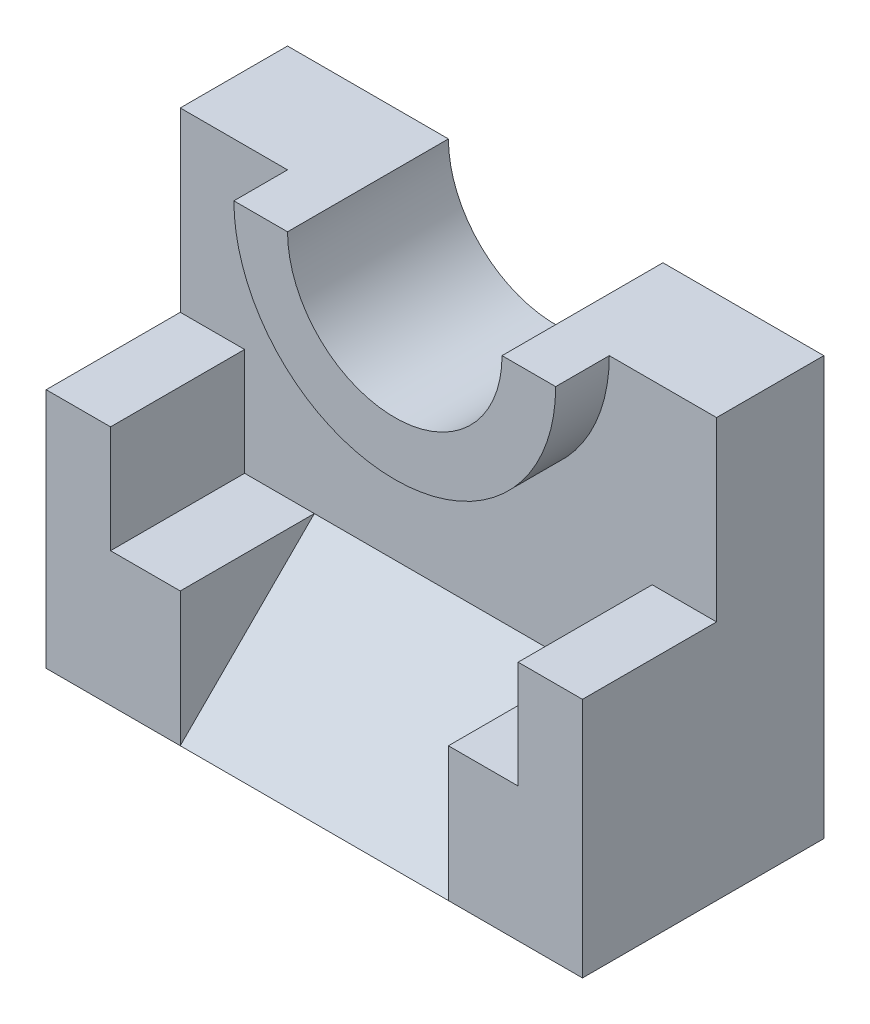
ISO-10303-21;
HEADER;
FILE_DESCRIPTION(('STEP AP214'),'2;1');
FILE_NAME('part.step','',(''),(''),'','','');
FILE_SCHEMA(('AUTOMOTIVE_DESIGN { 1 0 10303 214 1 1 1 1 }'));
ENDSEC;
DATA;
#1=APPLICATION_CONTEXT('core data for automotive mechanical design processes');
#2=APPLICATION_PROTOCOL_DEFINITION('international standard','automotive_design',2000,#1);
#3=PRODUCT_CONTEXT('',#1,'mechanical');
#4=PRODUCT('Part','Part','',(#3));
#5=PRODUCT_RELATED_PRODUCT_CATEGORY('part','',(#4));
#6=PRODUCT_DEFINITION_FORMATION('','',#4);
#7=PRODUCT_DEFINITION_CONTEXT('part definition',#1,'design');
#8=PRODUCT_DEFINITION('design','',#6,#7);
#9=PRODUCT_DEFINITION_SHAPE('','',#8);
#10=(LENGTH_UNIT() NAMED_UNIT(*) SI_UNIT(.MILLI.,.METRE.));
#11=(NAMED_UNIT(*) PLANE_ANGLE_UNIT() SI_UNIT($,.RADIAN.));
#12=(NAMED_UNIT(*) SI_UNIT($,.STERADIAN.) SOLID_ANGLE_UNIT());
#13=UNCERTAINTY_MEASURE_WITH_UNIT(LENGTH_MEASURE(1.E-05),#10,'distance_accuracy_value','');
#14=(GEOMETRIC_REPRESENTATION_CONTEXT(3) GLOBAL_UNCERTAINTY_ASSIGNED_CONTEXT((#13)) GLOBAL_UNIT_ASSIGNED_CONTEXT((#10,
#11,#12)) REPRESENTATION_CONTEXT('',''));
#15=CARTESIAN_POINT('',(0.,0.,0.));
#16=DIRECTION('',(0.,0.,1.));
#17=DIRECTION('',(1.,0.,0.));
#18=AXIS2_PLACEMENT_3D('',#15,#16,#17);
#19=CARTESIAN_POINT('',(71.6951431076401,-12.1166014811314,20.));
#20=DIRECTION('',(0.,-0.707106781186547,-0.707106781186548));
#21=DIRECTION('',(0.,0.707106781186548,-0.707106781186547));
#22=AXIS2_PLACEMENT_3D('',#19,#20,#21);
#23=PLANE('',#22);
#24=DIRECTION('',(0.,-0.707106781186548,0.707106781186547));
#25=VECTOR('',#24,1.);
#26=CARTESIAN_POINT('',(6.69514310764004,-12.1166014811314,20.));
#27=LINE('',#26,#25);
#28=CARTESIAN_POINT('',(6.69514310764004,-12.1166014811314,20.));
#29=VERTEX_POINT('',#28);
#30=CARTESIAN_POINT('',(6.69514310764004,-37.1166014811314,45.));
#31=VERTEX_POINT('',#30);
#32=EDGE_CURVE('E165',#29,#31,#27,.T.);
#33=ORIENTED_EDGE('',*,*,#32,.F.);
#34=DIRECTION('',(1.,0.,0.));
#35=VECTOR('',#34,1.);
#36=CARTESIAN_POINT('',(0.,-12.1166014811314,20.));
#37=LINE('',#36,#35);
#38=CARTESIAN_POINT('',(-43.30485689236,-12.1166014811314,20.));
#39=VERTEX_POINT('',#38);
#40=EDGE_CURVE('E62',#39,#29,#37,.T.);
#41=ORIENTED_EDGE('',*,*,#40,.F.);
#42=DIRECTION('',(0.,-0.707106781186548,0.707106781186547));
#43=VECTOR('',#42,1.);
#44=CARTESIAN_POINT('',(-43.30485689236,-12.1166014811314,20.));
#45=LINE('',#44,#43);
#46=CARTESIAN_POINT('',(-43.30485689236,-37.1166014811314,45.));
#47=VERTEX_POINT('',#46);
#48=EDGE_CURVE('E57',#39,#47,#45,.T.);
#49=ORIENTED_EDGE('',*,*,#48,.T.);
#50=DIRECTION('',(1.,0.,0.));
#51=VECTOR('',#50,1.);
#52=CARTESIAN_POINT('',(0.,-37.1166014811314,45.));
#53=LINE('',#52,#51);
#54=EDGE_CURVE('E183',#47,#31,#53,.T.);
#55=ORIENTED_EDGE('',*,*,#54,.T.);
#56=EDGE_LOOP('',(#33,#41,#49,#55));
#57=FACE_BOUND('',#56,.T.);
#58=ADVANCED_FACE('F41',(#57),#23,.F.);
#59=CARTESIAN_POINT('',(0.,0.,45.));
#60=DIRECTION('',(0.,0.,1.));
#61=DIRECTION('',(1.,0.,0.));
#62=AXIS2_PLACEMENT_3D('',#59,#60,#61);
#63=PLANE('',#62);
#64=DIRECTION('',(0.,-1.,0.));
#65=VECTOR('',#64,1.);
#66=CARTESIAN_POINT('',(19.69514310764,0.,45.));
#67=LINE('',#66,#65);
#68=CARTESIAN_POINT('',(19.69514310764,7.88339851886856,45.));
#69=VERTEX_POINT('',#68);
#70=CARTESIAN_POINT('',(19.69514310764,-12.1166014811314,45.));
#71=VERTEX_POINT('',#70);
#72=EDGE_CURVE('E274',#69,#71,#67,.T.);
#73=ORIENTED_EDGE('',*,*,#72,.T.);
#74=DIRECTION('',(1.,0.,0.));
#75=VECTOR('',#74,1.);
#76=CARTESIAN_POINT('',(6.69514310764004,-12.1166014811314,45.));
#77=LINE('',#76,#75);
#78=CARTESIAN_POINT('',(6.69514310764004,-12.1166014811314,45.));
#79=VERTEX_POINT('',#78);
#80=EDGE_CURVE('E181',#79,#71,#77,.T.);
#81=ORIENTED_EDGE('',*,*,#80,.F.);
#82=DIRECTION('',(0.,1.,0.));
#83=VECTOR('',#82,1.);
#84=CARTESIAN_POINT('',(6.69514310764004,-37.1166014811314,45.));
#85=LINE('',#84,#83);
#86=EDGE_CURVE('E167',#31,#79,#85,.T.);
#87=ORIENTED_EDGE('',*,*,#86,.F.);
#88=DIRECTION('',(1.,0.,0.));
#89=VECTOR('',#88,1.);
#90=CARTESIAN_POINT('',(6.69514310764004,-37.1166014811314,45.));
#91=LINE('',#90,#89);
#92=CARTESIAN_POINT('',(31.69514310764,-37.1166014811314,45.));
#93=VERTEX_POINT('',#92);
#94=EDGE_CURVE('E616',#31,#93,#91,.T.);
#95=ORIENTED_EDGE('',*,*,#94,.T.);
#96=DIRECTION('',(0.,1.,0.));
#97=VECTOR('',#96,1.);
#98=CARTESIAN_POINT('',(31.69514310764,0.,45.));
#99=LINE('',#98,#97);
#100=CARTESIAN_POINT('',(31.69514310764,7.88339851886856,45.));
#101=VERTEX_POINT('',#100);
#102=EDGE_CURVE('E417',#93,#101,#99,.T.);
#103=ORIENTED_EDGE('',*,*,#102,.T.);
#104=DIRECTION('',(-1.,0.,0.));
#105=VECTOR('',#104,1.);
#106=CARTESIAN_POINT('',(0.,7.88339851886856,45.));
#107=LINE('',#106,#105);
#108=EDGE_CURVE('E419',#101,#69,#107,.T.);
#109=ORIENTED_EDGE('',*,*,#108,.T.);
#110=EDGE_LOOP('',(#73,#81,#87,#95,#103,#109));
#111=FACE_BOUND('',#110,.T.);
#112=ADVANCED_FACE('F362',(#111),#63,.T.);
#113=CARTESIAN_POINT('',(31.69514310764,0.,20.));
#114=DIRECTION('',(-1.,0.,0.));
#115=DIRECTION('',(0.,0.,1.));
#116=AXIS2_PLACEMENT_3D('',#113,#114,#115);
#117=PLANE('',#116);
#118=ORIENTED_EDGE('',*,*,#102,.F.);
#119=DIRECTION('',(0.,0.,-1.));
#120=VECTOR('',#119,1.);
#121=CARTESIAN_POINT('',(31.69514310764,-37.1166014811314,45.));
#122=LINE('',#121,#120);
#123=CARTESIAN_POINT('',(31.69514310764,-37.1166014811314,0.));
#124=VERTEX_POINT('',#123);
#125=EDGE_CURVE('E285',#93,#124,#122,.T.);
#126=ORIENTED_EDGE('',*,*,#125,.T.);
#127=DIRECTION('',(0.,1.,0.));
#128=VECTOR('',#127,1.);
#129=CARTESIAN_POINT('',(31.69514310764,0.,0.));
#130=LINE('',#129,#128);
#131=CARTESIAN_POINT('',(31.69514310764,40.8833985188686,0.));
#132=VERTEX_POINT('',#131);
#133=EDGE_CURVE('E231',#124,#132,#130,.T.);
#134=ORIENTED_EDGE('',*,*,#133,.T.);
#135=DIRECTION('',(0.,0.,-1.));
#136=VECTOR('',#135,1.);
#137=CARTESIAN_POINT('',(31.69514310764,40.8833985188686,20.));
#138=LINE('',#137,#136);
#139=CARTESIAN_POINT('',(31.69514310764,40.8833985188686,20.));
#140=VERTEX_POINT('',#139);
#141=EDGE_CURVE('E11',#140,#132,#138,.T.);
#142=ORIENTED_EDGE('',*,*,#141,.F.);
#143=DIRECTION('',(0.,1.,0.));
#144=VECTOR('',#143,1.);
#145=CARTESIAN_POINT('',(31.69514310764,0.,20.));
#146=LINE('',#145,#144);
#147=CARTESIAN_POINT('',(31.69514310764,7.88339851886856,20.));
#148=VERTEX_POINT('',#147);
#149=EDGE_CURVE('E207',#148,#140,#146,.T.);
#150=ORIENTED_EDGE('',*,*,#149,.F.);
#151=DIRECTION('',(0.,0.,-1.));
#152=VECTOR('',#151,1.);
#153=CARTESIAN_POINT('',(31.69514310764,7.88339851886856,45.));
#154=LINE('',#153,#152);
#155=EDGE_CURVE('E282',#101,#148,#154,.T.);
#156=ORIENTED_EDGE('',*,*,#155,.F.);
#157=EDGE_LOOP('',(#118,#126,#134,#142,#150,#156));
#158=FACE_BOUND('',#157,.T.);
#159=ADVANCED_FACE('F43',(#158),#117,.F.);
#160=CARTESIAN_POINT('',(0.,40.8833985188686,20.));
#161=DIRECTION('',(0.,-1.,0.));
#162=DIRECTION('',(0.,0.,-1.));
#163=AXIS2_PLACEMENT_3D('',#160,#161,#162);
#164=PLANE('',#163);
#165=DIRECTION('',(-1.,0.,0.));
#166=VECTOR('',#165,1.);
#167=CARTESIAN_POINT('',(0.,40.8833985188686,0.));
#168=LINE('',#167,#166);
#169=CARTESIAN_POINT('',(1.69514310764005,40.8833985188686,0.));
#170=VERTEX_POINT('',#169);
#171=EDGE_CURVE('E234',#132,#170,#168,.T.);
#172=ORIENTED_EDGE('',*,*,#171,.T.);
#173=DIRECTION('',(0.,0.,-1.));
#174=VECTOR('',#173,1.);
#175=CARTESIAN_POINT('',(1.69514310764005,40.8833985188686,30.));
#176=LINE('',#175,#174);
#177=CARTESIAN_POINT('',(1.69514310764005,40.8833985188686,30.));
#178=VERTEX_POINT('',#177);
#179=EDGE_CURVE('E321',#178,#170,#176,.T.);
#180=ORIENTED_EDGE('',*,*,#179,.F.);
#181=DIRECTION('',(-1.,0.,0.));
#182=VECTOR('',#181,1.);
#183=CARTESIAN_POINT('',(0.,40.8833985188686,30.));
#184=LINE('',#183,#182);
#185=CARTESIAN_POINT('',(11.69514310764,40.8833985188686,30.));
#186=VERTEX_POINT('',#185);
#187=EDGE_CURVE('E309',#186,#178,#184,.T.);
#188=ORIENTED_EDGE('',*,*,#187,.F.);
#189=DIRECTION('',(0.,0.,-1.));
#190=VECTOR('',#189,1.);
#191=CARTESIAN_POINT('',(11.69514310764,40.8833985188686,30.));
#192=LINE('',#191,#190);
#193=CARTESIAN_POINT('',(11.69514310764,40.8833985188686,20.));
#194=VERTEX_POINT('',#193);
#195=EDGE_CURVE('E324',#186,#194,#192,.T.);
#196=ORIENTED_EDGE('',*,*,#195,.T.);
#197=DIRECTION('',(-1.,0.,0.));
#198=VECTOR('',#197,1.);
#199=CARTESIAN_POINT('',(0.,40.8833985188686,20.));
#200=LINE('',#199,#198);
#201=EDGE_CURVE('E210',#140,#194,#200,.T.);
#202=ORIENTED_EDGE('',*,*,#201,.F.);
#203=ORIENTED_EDGE('',*,*,#141,.T.);
#204=EDGE_LOOP('',(#172,#180,#188,#196,#202,#203));
#205=FACE_BOUND('',#204,.T.);
#206=ADVANCED_FACE('F341',(#205),#164,.F.);
#207=CARTESIAN_POINT('',(0.,40.8833985188686,20.));
#208=DIRECTION('',(0.,-1.,0.));
#209=DIRECTION('',(0.,0.,-1.));
#210=AXIS2_PLACEMENT_3D('',#207,#208,#209);
#211=PLANE('',#210);
#212=DIRECTION('',(-1.,0.,0.));
#213=VECTOR('',#212,1.);
#214=CARTESIAN_POINT('',(0.,40.8833985188686,0.));
#215=LINE('',#214,#213);
#216=CARTESIAN_POINT('',(-38.30485689236,40.8833985188686,0.));
#217=VERTEX_POINT('',#216);
#218=CARTESIAN_POINT('',(-68.30485689236,40.8833985188686,0.));
#219=VERTEX_POINT('',#218);
#220=EDGE_CURVE('E196',#217,#219,#215,.T.);
#221=ORIENTED_EDGE('',*,*,#220,.T.);
#222=DIRECTION('',(0.,0.,-1.));
#223=VECTOR('',#222,1.);
#224=CARTESIAN_POINT('',(-68.30485689236,40.8833985188686,20.));
#225=LINE('',#224,#223);
#226=CARTESIAN_POINT('',(-68.30485689236,40.8833985188686,20.));
#227=VERTEX_POINT('',#226);
#228=EDGE_CURVE('E50',#227,#219,#225,.T.);
#229=ORIENTED_EDGE('',*,*,#228,.F.);
#230=DIRECTION('',(-1.,0.,0.));
#231=VECTOR('',#230,1.);
#232=CARTESIAN_POINT('',(0.,40.8833985188686,20.));
#233=LINE('',#232,#231);
#234=CARTESIAN_POINT('',(-48.30485689236,40.8833985188686,20.));
#235=VERTEX_POINT('',#234);
#236=EDGE_CURVE('E217',#235,#227,#233,.T.);
#237=ORIENTED_EDGE('',*,*,#236,.F.);
#238=DIRECTION('',(0.,0.,-1.));
#239=VECTOR('',#238,1.);
#240=CARTESIAN_POINT('',(-48.30485689236,40.8833985188686,30.));
#241=LINE('',#240,#239);
#242=CARTESIAN_POINT('',(-48.30485689236,40.8833985188686,30.));
#243=VERTEX_POINT('',#242);
#244=EDGE_CURVE('E200',#243,#235,#241,.T.);
#245=ORIENTED_EDGE('',*,*,#244,.F.);
#246=DIRECTION('',(-1.,0.,0.));
#247=VECTOR('',#246,1.);
#248=CARTESIAN_POINT('',(0.,40.8833985188686,30.));
#249=LINE('',#248,#247);
#250=CARTESIAN_POINT('',(-38.30485689236,40.8833985188686,30.));
#251=VERTEX_POINT('',#250);
#252=EDGE_CURVE('E302',#251,#243,#249,.T.);
#253=ORIENTED_EDGE('',*,*,#252,.F.);
#254=DIRECTION('',(0.,0.,-1.));
#255=VECTOR('',#254,1.);
#256=CARTESIAN_POINT('',(-38.30485689236,40.8833985188686,30.));
#257=LINE('',#256,#255);
#258=EDGE_CURVE('E316',#251,#217,#257,.T.);
#259=ORIENTED_EDGE('',*,*,#258,.T.);
#260=EDGE_LOOP('',(#221,#229,#237,#245,#253,#259));
#261=FACE_BOUND('',#260,.T.);
#262=ADVANCED_FACE('F337',(#261),#211,.F.);
#263=CARTESIAN_POINT('',(-68.30485689236,0.,20.));
#264=DIRECTION('',(1.,0.,0.));
#265=DIRECTION('',(0.,0.,-1.));
#266=AXIS2_PLACEMENT_3D('',#263,#264,#265);
#267=PLANE('',#266);
#268=DIRECTION('',(0.,0.,-1.));
#269=VECTOR('',#268,1.);
#270=CARTESIAN_POINT('',(-68.30485689236,-37.1166014811314,45.));
#271=LINE('',#270,#269);
#272=CARTESIAN_POINT('',(-68.30485689236,-37.1166014811314,45.));
#273=VERTEX_POINT('',#272);
#274=CARTESIAN_POINT('',(-68.30485689236,-37.1166014811314,0.));
#275=VERTEX_POINT('',#274);
#276=EDGE_CURVE('E288',#273,#275,#271,.T.);
#277=ORIENTED_EDGE('',*,*,#276,.F.);
#278=DIRECTION('',(0.,-1.,0.));
#279=VECTOR('',#278,1.);
#280=CARTESIAN_POINT('',(-68.30485689236,0.,45.));
#281=LINE('',#280,#279);
#282=CARTESIAN_POINT('',(-68.30485689236,7.88339851886856,45.));
#283=VERTEX_POINT('',#282);
#284=EDGE_CURVE('E410',#283,#273,#281,.T.);
#285=ORIENTED_EDGE('',*,*,#284,.F.);
#286=DIRECTION('',(0.,0.,-1.));
#287=VECTOR('',#286,1.);
#288=CARTESIAN_POINT('',(-68.30485689236,7.88339851886856,45.));
#289=LINE('',#288,#287);
#290=CARTESIAN_POINT('',(-68.30485689236,7.88339851886856,20.));
#291=VERTEX_POINT('',#290);
#292=EDGE_CURVE('E291',#283,#291,#289,.T.);
#293=ORIENTED_EDGE('',*,*,#292,.T.);
#294=DIRECTION('',(0.,-1.,0.));
#295=VECTOR('',#294,1.);
#296=CARTESIAN_POINT('',(-68.30485689236,0.,20.));
#297=LINE('',#296,#295);
#298=EDGE_CURVE('E220',#227,#291,#297,.T.);
#299=ORIENTED_EDGE('',*,*,#298,.F.);
#300=ORIENTED_EDGE('',*,*,#228,.T.);
#301=DIRECTION('',(0.,-1.,0.));
#302=VECTOR('',#301,1.);
#303=CARTESIAN_POINT('',(-68.30485689236,0.,0.));
#304=LINE('',#303,#302);
#305=EDGE_CURVE('E191',#219,#275,#304,.T.);
#306=ORIENTED_EDGE('',*,*,#305,.T.);
#307=EDGE_LOOP('',(#277,#285,#293,#299,#300,#306));
#308=FACE_BOUND('',#307,.T.);
#309=ADVANCED_FACE('F245',(#308),#267,.F.);
#310=CARTESIAN_POINT('',(0.,0.,20.));
#311=DIRECTION('',(0.,0.,1.));
#312=DIRECTION('',(1.,0.,0.));
#313=AXIS2_PLACEMENT_3D('',#310,#311,#312);
#314=PLANE('',#313);
#315=CARTESIAN_POINT('',(-56.30485689236,-12.1166014811314,20.));
#316=VERTEX_POINT('',#315);
#317=EDGE_CURVE('E189',#316,#39,#37,.T.);
#318=ORIENTED_EDGE('',*,*,#317,.T.);
#319=ORIENTED_EDGE('',*,*,#40,.T.);
#320=DIRECTION('',(1.,0.,0.));
#321=VECTOR('',#320,1.);
#322=CARTESIAN_POINT('',(6.69514310764004,-12.1166014811314,20.));
#323=LINE('',#322,#321);
#324=CARTESIAN_POINT('',(19.69514310764,-12.1166014811314,20.));
#325=VERTEX_POINT('',#324);
#326=EDGE_CURVE('E173',#29,#325,#323,.T.);
#327=ORIENTED_EDGE('',*,*,#326,.T.);
#328=DIRECTION('',(0.,-1.,0.));
#329=VECTOR('',#328,1.);
#330=CARTESIAN_POINT('',(19.69514310764,0.,20.));
#331=LINE('',#330,#329);
#332=CARTESIAN_POINT('',(19.69514310764,7.88339851886856,20.));
#333=VERTEX_POINT('',#332);
#334=EDGE_CURVE('E195',#333,#325,#331,.T.);
#335=ORIENTED_EDGE('',*,*,#334,.F.);
#336=DIRECTION('',(-1.,0.,0.));
#337=VECTOR('',#336,1.);
#338=CARTESIAN_POINT('',(0.,7.88339851886856,20.));
#339=LINE('',#338,#337);
#340=EDGE_CURVE('E204',#148,#333,#339,.T.);
#341=ORIENTED_EDGE('',*,*,#340,.F.);
#342=ORIENTED_EDGE('',*,*,#149,.T.);
#343=ORIENTED_EDGE('',*,*,#201,.T.);
#344=CARTESIAN_POINT('',(-18.30485689236,40.8833985188686,20.));
#345=DIRECTION('',(0.,0.,1.));
#346=DIRECTION('',(1.,0.,0.));
#347=AXIS2_PLACEMENT_3D('',#344,#345,#346);
#348=CIRCLE('',#347,30.);
#349=EDGE_CURVE('E214',#235,#194,#348,.T.);
#350=ORIENTED_EDGE('',*,*,#349,.F.);
#351=ORIENTED_EDGE('',*,*,#236,.T.);
#352=ORIENTED_EDGE('',*,*,#298,.T.);
#353=DIRECTION('',(1.,0.,0.));
#354=VECTOR('',#353,1.);
#355=CARTESIAN_POINT('',(0.,7.88339851886856,20.));
#356=LINE('',#355,#354);
#357=CARTESIAN_POINT('',(-56.30485689236,7.88339851886856,20.));
#358=VERTEX_POINT('',#357);
#359=EDGE_CURVE('E224',#291,#358,#356,.T.);
#360=ORIENTED_EDGE('',*,*,#359,.T.);
#361=DIRECTION('',(0.,-1.,0.));
#362=VECTOR('',#361,1.);
#363=CARTESIAN_POINT('',(-56.30485689236,0.,20.));
#364=LINE('',#363,#362);
#365=EDGE_CURVE('E228',#358,#316,#364,.T.);
#366=ORIENTED_EDGE('',*,*,#365,.T.);
#367=EDGE_LOOP('',(#318,#319,#327,#335,#341,#342,#343,#350,#351,#352,#360,#366));
#368=FACE_BOUND('',#367,.T.);
#369=ADVANCED_FACE('F186',(#368),#314,.T.);
#370=CARTESIAN_POINT('',(0.,0.,0.));
#371=DIRECTION('',(0.,0.,1.));
#372=DIRECTION('',(1.,0.,0.));
#373=AXIS2_PLACEMENT_3D('',#370,#371,#372);
#374=PLANE('',#373);
#375=DIRECTION('',(1.,0.,0.));
#376=VECTOR('',#375,1.);
#377=CARTESIAN_POINT('',(0.,-37.1166014811314,0.));
#378=LINE('',#377,#376);
#379=EDGE_CURVE('E256',#275,#124,#378,.T.);
#380=ORIENTED_EDGE('',*,*,#379,.F.);
#381=ORIENTED_EDGE('',*,*,#305,.F.);
#382=ORIENTED_EDGE('',*,*,#220,.F.);
#383=CARTESIAN_POINT('',(-18.30485689236,40.8833985188686,0.));
#384=DIRECTION('',(0.,0.,1.));
#385=DIRECTION('',(1.,0.,0.));
#386=AXIS2_PLACEMENT_3D('',#383,#384,#385);
#387=CIRCLE('',#386,20.);
#388=EDGE_CURVE('E301',#217,#170,#387,.T.);
#389=ORIENTED_EDGE('',*,*,#388,.T.);
#390=ORIENTED_EDGE('',*,*,#171,.F.);
#391=ORIENTED_EDGE('',*,*,#133,.F.);
#392=EDGE_LOOP('',(#380,#381,#382,#389,#390,#391));
#393=FACE_BOUND('',#392,.T.);
#394=ADVANCED_FACE('F252',(#393),#374,.F.);
#395=CARTESIAN_POINT('',(-18.30485689236,40.8833985188686,30.));
#396=DIRECTION('',(0.,0.,-1.));
#397=DIRECTION('',(-1.,0.,0.));
#398=AXIS2_PLACEMENT_3D('',#395,#396,#397);
#399=CYLINDRICAL_SURFACE('',#398,30.);
#400=ORIENTED_EDGE('',*,*,#349,.T.);
#401=ORIENTED_EDGE('',*,*,#195,.F.);
#402=CARTESIAN_POINT('',(-18.30485689236,40.8833985188686,30.));
#403=DIRECTION('',(0.,0.,1.));
#404=DIRECTION('',(1.,0.,0.));
#405=AXIS2_PLACEMENT_3D('',#402,#403,#404);
#406=CIRCLE('',#405,30.);
#407=EDGE_CURVE('E306',#243,#186,#406,.T.);
#408=ORIENTED_EDGE('',*,*,#407,.F.);
#409=ORIENTED_EDGE('',*,*,#244,.T.);
#410=EDGE_LOOP('',(#400,#401,#408,#409));
#411=FACE_BOUND('',#410,.T.);
#412=ADVANCED_FACE('F334',(#411),#399,.T.);
#413=CARTESIAN_POINT('',(-18.30485689236,40.8833985188686,30.));
#414=DIRECTION('',(0.,0.,-1.));
#415=DIRECTION('',(-1.,0.,0.));
#416=AXIS2_PLACEMENT_3D('',#413,#414,#415);
#417=CYLINDRICAL_SURFACE('',#416,20.);
#418=ORIENTED_EDGE('',*,*,#388,.F.);
#419=ORIENTED_EDGE('',*,*,#258,.F.);
#420=CARTESIAN_POINT('',(-18.30485689236,40.8833985188686,30.));
#421=DIRECTION('',(0.,0.,1.));
#422=DIRECTION('',(1.,0.,0.));
#423=AXIS2_PLACEMENT_3D('',#420,#421,#422);
#424=CIRCLE('',#423,20.);
#425=EDGE_CURVE('E312',#251,#178,#424,.T.);
#426=ORIENTED_EDGE('',*,*,#425,.T.);
#427=ORIENTED_EDGE('',*,*,#179,.T.);
#428=EDGE_LOOP('',(#418,#419,#426,#427));
#429=FACE_BOUND('',#428,.T.);
#430=ADVANCED_FACE('F346',(#429),#417,.F.);
#431=CARTESIAN_POINT('',(0.,0.,30.));
#432=DIRECTION('',(0.,0.,1.));
#433=DIRECTION('',(1.,0.,0.));
#434=AXIS2_PLACEMENT_3D('',#431,#432,#433);
#435=PLANE('',#434);
#436=ORIENTED_EDGE('',*,*,#252,.T.);
#437=ORIENTED_EDGE('',*,*,#407,.T.);
#438=ORIENTED_EDGE('',*,*,#187,.T.);
#439=ORIENTED_EDGE('',*,*,#425,.F.);
#440=EDGE_LOOP('',(#436,#437,#438,#439));
#441=FACE_BOUND('',#440,.T.);
#442=ADVANCED_FACE('F349',(#441),#435,.T.);
#443=CARTESIAN_POINT('',(-56.30485689236,0.,45.));
#444=DIRECTION('',(1.,0.,0.));
#445=DIRECTION('',(0.,0.,-1.));
#446=AXIS2_PLACEMENT_3D('',#443,#444,#445);
#447=PLANE('',#446);
#448=DIRECTION('',(0.,0.,-1.));
#449=VECTOR('',#448,1.);
#450=CARTESIAN_POINT('',(-56.30485689236,-12.1166014811314,45.));
#451=LINE('',#450,#449);
#452=CARTESIAN_POINT('',(-56.30485689236,-12.1166014811314,45.));
#453=VERTEX_POINT('',#452);
#454=EDGE_CURVE('E298',#453,#316,#451,.T.);
#455=ORIENTED_EDGE('',*,*,#454,.T.);
#456=ORIENTED_EDGE('',*,*,#365,.F.);
#457=DIRECTION('',(0.,0.,-1.));
#458=VECTOR('',#457,1.);
#459=CARTESIAN_POINT('',(-56.30485689236,7.88339851886856,45.));
#460=LINE('',#459,#458);
#461=CARTESIAN_POINT('',(-56.30485689236,7.88339851886856,45.));
#462=VERTEX_POINT('',#461);
#463=EDGE_CURVE('E294',#462,#358,#460,.T.);
#464=ORIENTED_EDGE('',*,*,#463,.F.);
#465=DIRECTION('',(0.,-1.,0.));
#466=VECTOR('',#465,1.);
#467=CARTESIAN_POINT('',(-56.30485689236,0.,45.));
#468=LINE('',#467,#466);
#469=EDGE_CURVE('E262',#462,#453,#468,.T.);
#470=ORIENTED_EDGE('',*,*,#469,.T.);
#471=EDGE_LOOP('',(#455,#456,#464,#470));
#472=FACE_BOUND('',#471,.T.);
#473=ADVANCED_FACE('F351',(#472),#447,.T.);
#474=CARTESIAN_POINT('',(0.,7.88339851886856,45.));
#475=DIRECTION('',(0.,1.,0.));
#476=DIRECTION('',(0.,0.,1.));
#477=AXIS2_PLACEMENT_3D('',#474,#475,#476);
#478=PLANE('',#477);
#479=ORIENTED_EDGE('',*,*,#463,.T.);
#480=ORIENTED_EDGE('',*,*,#359,.F.);
#481=ORIENTED_EDGE('',*,*,#292,.F.);
#482=DIRECTION('',(1.,0.,0.));
#483=VECTOR('',#482,1.);
#484=CARTESIAN_POINT('',(0.,7.88339851886856,45.));
#485=LINE('',#484,#483);
#486=EDGE_CURVE('E267',#283,#462,#485,.T.);
#487=ORIENTED_EDGE('',*,*,#486,.T.);
#488=EDGE_LOOP('',(#479,#480,#481,#487));
#489=FACE_BOUND('',#488,.T.);
#490=ADVANCED_FACE('F357',(#489),#478,.T.);
#491=CARTESIAN_POINT('',(0.,-37.1166014811314,45.));
#492=DIRECTION('',(0.,1.,0.));
#493=DIRECTION('',(0.,0.,1.));
#494=AXIS2_PLACEMENT_3D('',#491,#492,#493);
#495=PLANE('',#494);
#496=ORIENTED_EDGE('',*,*,#379,.T.);
#497=ORIENTED_EDGE('',*,*,#125,.F.);
#498=ORIENTED_EDGE('',*,*,#94,.F.);
#499=ORIENTED_EDGE('',*,*,#54,.F.);
#500=EDGE_CURVE('E413',#273,#47,#53,.T.);
#501=ORIENTED_EDGE('',*,*,#500,.F.);
#502=ORIENTED_EDGE('',*,*,#276,.T.);
#503=EDGE_LOOP('',(#496,#497,#498,#499,#501,#502));
#504=FACE_BOUND('',#503,.T.);
#505=ADVANCED_FACE('F383',(#504),#495,.F.);
#506=CARTESIAN_POINT('',(0.,7.88339851886856,45.));
#507=DIRECTION('',(0.,-1.,0.));
#508=DIRECTION('',(0.,0.,-1.));
#509=AXIS2_PLACEMENT_3D('',#506,#507,#508);
#510=PLANE('',#509);
#511=ORIENTED_EDGE('',*,*,#340,.T.);
#512=DIRECTION('',(0.,0.,-1.));
#513=VECTOR('',#512,1.);
#514=CARTESIAN_POINT('',(19.69514310764,7.88339851886856,45.));
#515=LINE('',#514,#513);
#516=EDGE_CURVE('E278',#69,#333,#515,.T.);
#517=ORIENTED_EDGE('',*,*,#516,.F.);
#518=ORIENTED_EDGE('',*,*,#108,.F.);
#519=ORIENTED_EDGE('',*,*,#155,.T.);
#520=EDGE_LOOP('',(#511,#517,#518,#519));
#521=FACE_BOUND('',#520,.T.);
#522=ADVANCED_FACE('F379',(#521),#510,.F.);
#523=CARTESIAN_POINT('',(19.69514310764,0.,45.));
#524=DIRECTION('',(1.,0.,0.));
#525=DIRECTION('',(0.,0.,-1.));
#526=AXIS2_PLACEMENT_3D('',#523,#524,#525);
#527=PLANE('',#526);
#528=ORIENTED_EDGE('',*,*,#334,.T.);
#529=DIRECTION('',(0.,0.,-1.));
#530=VECTOR('',#529,1.);
#531=CARTESIAN_POINT('',(19.69514310764,-12.1166014811314,45.));
#532=LINE('',#531,#530);
#533=EDGE_CURVE('E176',#71,#325,#532,.T.);
#534=ORIENTED_EDGE('',*,*,#533,.F.);
#535=ORIENTED_EDGE('',*,*,#72,.F.);
#536=ORIENTED_EDGE('',*,*,#516,.T.);
#537=EDGE_LOOP('',(#528,#534,#535,#536));
#538=FACE_BOUND('',#537,.T.);
#539=ADVANCED_FACE('F375',(#538),#527,.F.);
#540=ORIENTED_EDGE('',*,*,#284,.T.);
#541=ORIENTED_EDGE('',*,*,#500,.T.);
#542=DIRECTION('',(0.,1.,0.));
#543=VECTOR('',#542,1.);
#544=CARTESIAN_POINT('',(-43.30485689236,-37.1166014811314,45.));
#545=LINE('',#544,#543);
#546=CARTESIAN_POINT('',(-43.30485689236,-12.1166014811314,45.));
#547=VERTEX_POINT('',#546);
#548=EDGE_CURVE('E402',#47,#547,#545,.T.);
#549=ORIENTED_EDGE('',*,*,#548,.T.);
#550=DIRECTION('',(-1.,0.,0.));
#551=VECTOR('',#550,1.);
#552=CARTESIAN_POINT('',(-43.30485689236,-12.1166014811314,45.));
#553=LINE('',#552,#551);
#554=EDGE_CURVE('E263',#547,#453,#553,.T.);
#555=ORIENTED_EDGE('',*,*,#554,.T.);
#556=ORIENTED_EDGE('',*,*,#469,.F.);
#557=ORIENTED_EDGE('',*,*,#486,.F.);
#558=EDGE_LOOP('',(#540,#541,#549,#555,#556,#557));
#559=FACE_BOUND('',#558,.T.);
#560=ADVANCED_FACE('F369',(#559),#63,.T.);
#561=CARTESIAN_POINT('',(-43.30485689236,-12.1166014811314,45.));
#562=DIRECTION('',(0.,1.,0.));
#563=DIRECTION('',(0.,0.,1.));
#564=AXIS2_PLACEMENT_3D('',#561,#562,#563);
#565=PLANE('',#564);
#566=ORIENTED_EDGE('',*,*,#317,.F.);
#567=ORIENTED_EDGE('',*,*,#454,.F.);
#568=ORIENTED_EDGE('',*,*,#554,.F.);
#569=DIRECTION('',(0.,0.,-1.));
#570=VECTOR('',#569,1.);
#571=CARTESIAN_POINT('',(-43.30485689236,-12.1166014811314,45.));
#572=LINE('',#571,#570);
#573=EDGE_CURVE('E270',#547,#39,#572,.T.);
#574=ORIENTED_EDGE('',*,*,#573,.T.);
#575=EDGE_LOOP('',(#566,#567,#568,#574));
#576=FACE_BOUND('',#575,.T.);
#577=ADVANCED_FACE('F371',(#576),#565,.T.);
#578=CARTESIAN_POINT('',(-43.30485689236,0.,0.));
#579=DIRECTION('',(-1.,0.,0.));
#580=DIRECTION('',(0.,0.,1.));
#581=AXIS2_PLACEMENT_3D('',#578,#579,#580);
#582=PLANE('',#581);
#583=ORIENTED_EDGE('',*,*,#48,.F.);
#584=ORIENTED_EDGE('',*,*,#573,.F.);
#585=ORIENTED_EDGE('',*,*,#548,.F.);
#586=EDGE_LOOP('',(#583,#584,#585));
#587=FACE_BOUND('',#586,.T.);
#588=ADVANCED_FACE('F505',(#587),#582,.F.);
#589=CARTESIAN_POINT('',(6.69514310764004,-12.1166014811314,45.));
#590=DIRECTION('',(0.,-1.,0.));
#591=DIRECTION('',(0.,0.,-1.));
#592=AXIS2_PLACEMENT_3D('',#589,#590,#591);
#593=PLANE('',#592);
#594=ORIENTED_EDGE('',*,*,#80,.T.);
#595=ORIENTED_EDGE('',*,*,#533,.T.);
#596=ORIENTED_EDGE('',*,*,#326,.F.);
#597=DIRECTION('',(0.,0.,-1.));
#598=VECTOR('',#597,1.);
#599=CARTESIAN_POINT('',(6.69514310764004,-12.1166014811314,45.));
#600=LINE('',#599,#598);
#601=EDGE_CURVE('E162',#79,#29,#600,.T.);
#602=ORIENTED_EDGE('',*,*,#601,.F.);
#603=EDGE_LOOP('',(#594,#595,#596,#602));
#604=FACE_BOUND('',#603,.T.);
#605=ADVANCED_FACE('F174',(#604),#593,.F.);
#606=CARTESIAN_POINT('',(6.69514310764004,0.,0.));
#607=DIRECTION('',(1.,0.,0.));
#608=DIRECTION('',(0.,0.,1.));
#609=AXIS2_PLACEMENT_3D('',#606,#607,#608);
#610=PLANE('',#609);
#611=ORIENTED_EDGE('',*,*,#32,.T.);
#612=ORIENTED_EDGE('',*,*,#86,.T.);
#613=ORIENTED_EDGE('',*,*,#601,.T.);
#614=EDGE_LOOP('',(#611,#612,#613));
#615=FACE_BOUND('',#614,.T.);
#616=ADVANCED_FACE('F164',(#615),#610,.F.);
#617=CLOSED_SHELL('',(#58,#112,#159,#206,#262,#309,#369,#394,#412,#430,#442,#473,#490,#505,#522,
#539,#560,#577,#588,#605,#616));
#618=MANIFOLD_SOLID_BREP('B2',#617);
#619=ADVANCED_BREP_SHAPE_REPRESENTATION('',(#18,#618),#14);
#620=SHAPE_DEFINITION_REPRESENTATION(#9,#619);
ENDSEC;
END-ISO-10303-21;
